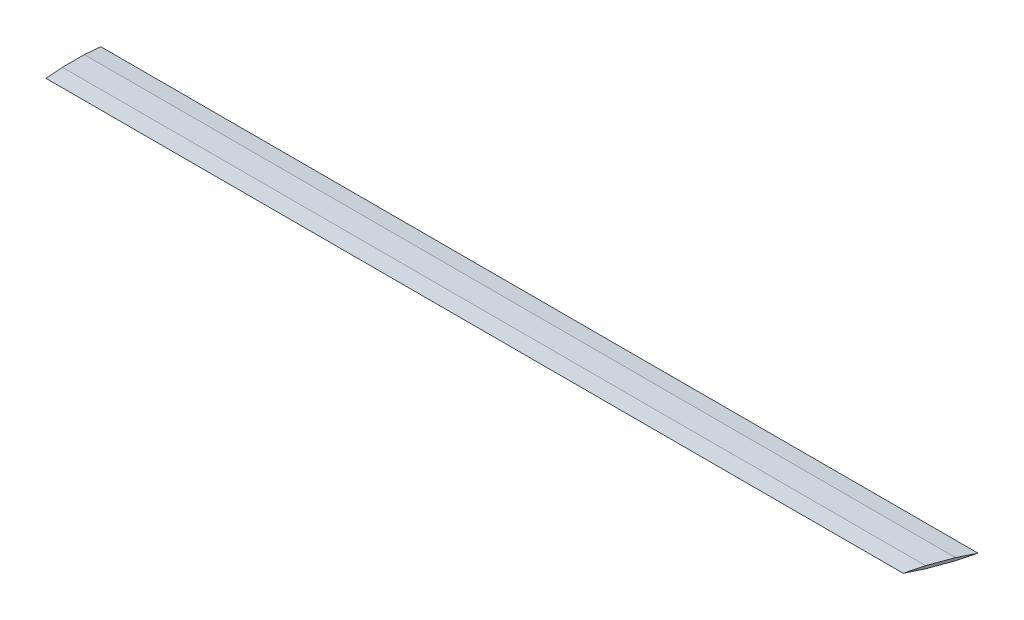
ISO-10303-21;
HEADER;
FILE_DESCRIPTION(('STEP AP214'),'2;1');
FILE_NAME('part.step','',(''),(''),'','','');
FILE_SCHEMA(('AUTOMOTIVE_DESIGN { 1 0 10303 214 1 1 1 1 }'));
ENDSEC;
DATA;
#1=APPLICATION_CONTEXT('core data for automotive mechanical design processes');
#2=APPLICATION_PROTOCOL_DEFINITION('international standard','automotive_design',2000,#1);
#3=PRODUCT_CONTEXT('',#1,'mechanical');
#4=PRODUCT('Part','Part','',(#3));
#5=PRODUCT_RELATED_PRODUCT_CATEGORY('part','',(#4));
#6=PRODUCT_DEFINITION_FORMATION('','',#4);
#7=PRODUCT_DEFINITION_CONTEXT('part definition',#1,'design');
#8=PRODUCT_DEFINITION('design','',#6,#7);
#9=PRODUCT_DEFINITION_SHAPE('','',#8);
#10=(LENGTH_UNIT() NAMED_UNIT(*) SI_UNIT(.MILLI.,.METRE.));
#11=(NAMED_UNIT(*) PLANE_ANGLE_UNIT() SI_UNIT($,.RADIAN.));
#12=(NAMED_UNIT(*) SI_UNIT($,.STERADIAN.) SOLID_ANGLE_UNIT());
#13=UNCERTAINTY_MEASURE_WITH_UNIT(LENGTH_MEASURE(1.E-05),#10,'distance_accuracy_value','');
#14=(GEOMETRIC_REPRESENTATION_CONTEXT(3) GLOBAL_UNCERTAINTY_ASSIGNED_CONTEXT((#13)) GLOBAL_UNIT_ASSIGNED_CONTEXT((#10,
#11,#12)) REPRESENTATION_CONTEXT('',''));
#15=CARTESIAN_POINT('',(0.,0.,0.));
#16=DIRECTION('',(0.,0.,1.));
#17=DIRECTION('',(1.,0.,0.));
#18=AXIS2_PLACEMENT_3D('',#15,#16,#17);
#19=CARTESIAN_POINT('',(0.,1.,0.));
#20=DIRECTION('',(-1.,0.,0.));
#21=DIRECTION('',(0.,0.,1.));
#22=AXIS2_PLACEMENT_3D('',#19,#20,#21);
#23=PLANE('',#22);
#24=DIRECTION('',(0.,0.,-1.));
#25=VECTOR('',#24,1.);
#26=CARTESIAN_POINT('',(0.,0.,0.));
#27=LINE('',#26,#25);
#28=CARTESIAN_POINT('',(0.,0.,14.));
#29=VERTEX_POINT('',#28);
#30=CARTESIAN_POINT('',(0.,0.,6.));
#31=VERTEX_POINT('',#30);
#32=EDGE_CURVE('E90',#29,#31,#27,.T.);
#33=ORIENTED_EDGE('',*,*,#32,.F.);
#34=DIRECTION('',(0.,0.08304547985374,0.99654575824488));
#35=VECTOR('',#34,1.);
#36=CARTESIAN_POINT('',(0.,-1.15172413793103,0.179310344827586));
#37=LINE('',#36,#35);
#38=CARTESIAN_POINT('',(0.,0.500000000000003,20.));
#39=VERTEX_POINT('',#38);
#40=EDGE_CURVE('E130',#29,#39,#37,.T.);
#41=ORIENTED_EDGE('',*,*,#40,.T.);
#42=DIRECTION('',(0.,-0.0830454798537364,0.99654575824488));
#43=VECTOR('',#42,1.);
#44=CARTESIAN_POINT('',(0.,2.1586206896551,0.0965517241379211));
#45=LINE('',#44,#43);
#46=CARTESIAN_POINT('',(0.,1.,13.9999999999998));
#47=VERTEX_POINT('',#46);
#48=EDGE_CURVE('E128',#39,#47,#45,.F.);
#49=ORIENTED_EDGE('',*,*,#48,.T.);
#50=DIRECTION('',(0.,0.,-1.));
#51=VECTOR('',#50,1.);
#52=CARTESIAN_POINT('',(0.,1.,0.));
#53=LINE('',#52,#51);
#54=CARTESIAN_POINT('',(0.,1.,6.00000000000028));
#55=VERTEX_POINT('',#54);
#56=EDGE_CURVE('E118',#47,#55,#53,.T.);
#57=ORIENTED_EDGE('',*,*,#56,.T.);
#58=DIRECTION('',(0.,0.0830454798537367,0.99654575824488));
#59=VECTOR('',#58,1.);
#60=CARTESIAN_POINT('',(0.,0.503448275862065,0.0413793103448263));
#61=LINE('',#60,#59);
#62=CARTESIAN_POINT('',(0.,0.499999999999996,0.));
#63=VERTEX_POINT('',#62);
#64=EDGE_CURVE('E106',#55,#63,#61,.F.);
#65=ORIENTED_EDGE('',*,*,#64,.T.);
#66=DIRECTION('',(0.,-0.08304547985374,0.99654575824488));
#67=VECTOR('',#66,1.);
#68=CARTESIAN_POINT('',(0.,0.503448275862069,-0.0413793103448276));
#69=LINE('',#68,#67);
#70=EDGE_CURVE('E104',#63,#31,#69,.T.);
#71=ORIENTED_EDGE('',*,*,#70,.T.);
#72=EDGE_LOOP('',(#33,#41,#49,#57,#65,#71));
#73=FACE_BOUND('',#72,.T.);
#74=ADVANCED_FACE('F35',(#73),#23,.T.);
#75=CARTESIAN_POINT('',(282.567110899036,1.,102.846017549847));
#76=DIRECTION('',(0.939692620785907,0.,0.342020143325672));
#77=DIRECTION('',(0.342020143325672,0.,-0.939692620785907));
#78=AXIS2_PLACEMENT_3D('',#75,#76,#77);
#79=PLANE('',#78);
#80=DIRECTION('',(0.340976290985637,0.0780687216710314,-0.936824660052418));
#81=VECTOR('',#80,1.);
#82=CARTESIAN_POINT('',(282.764197895067,-6.35871045654838,102.304525478584));
#83=LINE('',#82,#81);
#84=CARTESIAN_POINT('',(314.904416720273,1.,13.9999999999998));
#85=VERTEX_POINT('',#84);
#86=CARTESIAN_POINT('',(312.720595314676,0.500000000000003,20.));
#87=VERTEX_POINT('',#86);
#88=EDGE_CURVE('E51',#85,#87,#83,.F.);
#89=ORIENTED_EDGE('',*,*,#88,.T.);
#90=DIRECTION('',(0.340976290985637,-0.0780687216710348,-0.936824660052418));
#91=VECTOR('',#90,1.);
#92=CARTESIAN_POINT('',(282.737578311909,7.36480518185203,102.377662182224));
#93=LINE('',#92,#91);
#94=CARTESIAN_POINT('',(314.904416720273,0.,14.));
#95=VERTEX_POINT('',#94);
#96=EDGE_CURVE('E44',#87,#95,#93,.T.);
#97=ORIENTED_EDGE('',*,*,#96,.T.);
#98=DIRECTION('',(-0.342020143325672,0.,0.939692620785907));
#99=VECTOR('',#98,1.);
#100=CARTESIAN_POINT('',(282.567110899036,0.,102.846017549847));
#101=LINE('',#100,#99);
#102=CARTESIAN_POINT('',(317.816178594403,0.,5.99999999999999));
#103=VERTEX_POINT('',#102);
#104=EDGE_CURVE('E100',#103,#95,#101,.T.);
#105=ORIENTED_EDGE('',*,*,#104,.F.);
#106=DIRECTION('',(0.340976290985637,0.0780687216710348,-0.936824660052418));
#107=VECTOR('',#106,1.);
#108=CARTESIAN_POINT('',(282.808563866996,-8.01521924770977,102.182630972517));
#109=LINE('',#108,#107);
#110=CARTESIAN_POINT('',(320.,0.499999999999996,0.));
#111=VERTEX_POINT('',#110);
#112=EDGE_CURVE('E113',#103,#111,#109,.T.);
#113=ORIENTED_EDGE('',*,*,#112,.T.);
#114=DIRECTION('',(0.340976290985637,-0.0780687216710318,-0.936824660052418));
#115=VECTOR('',#114,1.);
#116=CARTESIAN_POINT('',(282.781944283838,9.02131397301278,102.255767676157));
#117=LINE('',#116,#115);
#118=CARTESIAN_POINT('',(317.816178594403,1.,6.00000000000027));
#119=VERTEX_POINT('',#118);
#120=EDGE_CURVE('E114',#111,#119,#117,.F.);
#121=ORIENTED_EDGE('',*,*,#120,.T.);
#122=DIRECTION('',(-0.342020143325672,0.,0.939692620785907));
#123=VECTOR('',#122,1.);
#124=CARTESIAN_POINT('',(282.567110899036,1.,102.846017549847));
#125=LINE('',#124,#123);
#126=EDGE_CURVE('E115',#119,#85,#125,.T.);
#127=ORIENTED_EDGE('',*,*,#126,.T.);
#128=EDGE_LOOP('',(#89,#97,#105,#113,#121,#127));
#129=FACE_BOUND('',#128,.T.);
#130=ADVANCED_FACE('F134',(#129),#79,.T.);
#131=CARTESIAN_POINT('',(0.,1.,0.));
#132=DIRECTION('',(0.,1.,0.));
#133=DIRECTION('',(0.,0.,1.));
#134=AXIS2_PLACEMENT_3D('',#131,#132,#133);
#135=PLANE('',#134);
#136=ORIENTED_EDGE('',*,*,#56,.F.);
#137=DIRECTION('',(1.,0.,0.));
#138=VECTOR('',#137,1.);
#139=CARTESIAN_POINT('',(0.,1.,13.9999999999998));
#140=LINE('',#139,#138);
#141=EDGE_CURVE('E11',#47,#85,#140,.T.);
#142=ORIENTED_EDGE('',*,*,#141,.T.);
#143=ORIENTED_EDGE('',*,*,#126,.F.);
#144=DIRECTION('',(-1.,0.,0.));
#145=VECTOR('',#144,1.);
#146=CARTESIAN_POINT('',(0.,1.,6.00000000000028));
#147=LINE('',#146,#145);
#148=EDGE_CURVE('E110',#119,#55,#147,.T.);
#149=ORIENTED_EDGE('',*,*,#148,.T.);
#150=EDGE_LOOP('',(#136,#142,#143,#149));
#151=FACE_BOUND('',#150,.T.);
#152=ADVANCED_FACE('F152',(#151),#135,.T.);
#153=CARTESIAN_POINT('',(0.,0.,0.));
#154=DIRECTION('',(0.,1.,0.));
#155=DIRECTION('',(0.,0.,1.));
#156=AXIS2_PLACEMENT_3D('',#153,#154,#155);
#157=PLANE('',#156);
#158=ORIENTED_EDGE('',*,*,#104,.T.);
#159=DIRECTION('',(-1.,0.,0.));
#160=VECTOR('',#159,1.);
#161=CARTESIAN_POINT('',(0.,0.,14.));
#162=LINE('',#161,#160);
#163=EDGE_CURVE('E98',#95,#29,#162,.T.);
#164=ORIENTED_EDGE('',*,*,#163,.T.);
#165=ORIENTED_EDGE('',*,*,#32,.T.);
#166=DIRECTION('',(1.,0.,0.));
#167=VECTOR('',#166,1.);
#168=CARTESIAN_POINT('',(320.,0.,6.));
#169=LINE('',#168,#167);
#170=EDGE_CURVE('E95',#31,#103,#169,.T.);
#171=ORIENTED_EDGE('',*,*,#170,.T.);
#172=EDGE_LOOP('',(#158,#164,#165,#171));
#173=FACE_BOUND('',#172,.T.);
#174=ADVANCED_FACE('F93',(#173),#157,.F.);
#175=CARTESIAN_POINT('',(0.,0.499999999999996,0.));
#176=DIRECTION('',(0.,-0.99654575824488,0.0830454798537367));
#177=DIRECTION('',(1.,0.,0.));
#178=AXIS2_PLACEMENT_3D('',#175,#176,#177);
#179=PLANE('',#178);
#180=DIRECTION('',(1.,0.,0.));
#181=VECTOR('',#180,1.);
#182=CARTESIAN_POINT('',(0.,0.499999999999996,0.));
#183=LINE('',#182,#181);
#184=EDGE_CURVE('E101',#63,#111,#183,.T.);
#185=ORIENTED_EDGE('',*,*,#184,.F.);
#186=ORIENTED_EDGE('',*,*,#64,.F.);
#187=ORIENTED_EDGE('',*,*,#148,.F.);
#188=ORIENTED_EDGE('',*,*,#120,.F.);
#189=EDGE_LOOP('',(#185,#186,#187,#188));
#190=FACE_BOUND('',#189,.T.);
#191=ADVANCED_FACE('F145',(#190),#179,.F.);
#192=CARTESIAN_POINT('',(0.,0.,6.));
#193=DIRECTION('',(0.,-0.99654575824488,-0.08304547985374));
#194=DIRECTION('',(-1.,0.,0.));
#195=AXIS2_PLACEMENT_3D('',#192,#193,#194);
#196=PLANE('',#195);
#197=ORIENTED_EDGE('',*,*,#70,.F.);
#198=ORIENTED_EDGE('',*,*,#184,.T.);
#199=ORIENTED_EDGE('',*,*,#112,.F.);
#200=ORIENTED_EDGE('',*,*,#170,.F.);
#201=EDGE_LOOP('',(#197,#198,#199,#200));
#202=FACE_BOUND('',#201,.T.);
#203=ADVANCED_FACE('F112',(#202),#196,.T.);
#204=CARTESIAN_POINT('',(0.,0.500000000000003,20.));
#205=DIRECTION('',(0.,-0.99654575824488,-0.0830454798537363));
#206=DIRECTION('',(-1.,0.,0.));
#207=AXIS2_PLACEMENT_3D('',#204,#205,#206);
#208=PLANE('',#207);
#209=DIRECTION('',(-1.,0.,0.));
#210=VECTOR('',#209,1.);
#211=CARTESIAN_POINT('',(0.,0.500000000000003,20.));
#212=LINE('',#211,#210);
#213=EDGE_CURVE('E39',#87,#39,#212,.T.);
#214=ORIENTED_EDGE('',*,*,#213,.F.);
#215=ORIENTED_EDGE('',*,*,#88,.F.);
#216=ORIENTED_EDGE('',*,*,#141,.F.);
#217=ORIENTED_EDGE('',*,*,#48,.F.);
#218=EDGE_LOOP('',(#214,#215,#216,#217));
#219=FACE_BOUND('',#218,.T.);
#220=ADVANCED_FACE('F37',(#219),#208,.F.);
#221=CARTESIAN_POINT('',(0.,0.,14.));
#222=DIRECTION('',(0.,-0.99654575824488,0.08304547985374));
#223=DIRECTION('',(1.,0.,0.));
#224=AXIS2_PLACEMENT_3D('',#221,#222,#223);
#225=PLANE('',#224);
#226=ORIENTED_EDGE('',*,*,#96,.F.);
#227=ORIENTED_EDGE('',*,*,#213,.T.);
#228=ORIENTED_EDGE('',*,*,#40,.F.);
#229=ORIENTED_EDGE('',*,*,#163,.F.);
#230=EDGE_LOOP('',(#226,#227,#228,#229));
#231=FACE_BOUND('',#230,.T.);
#232=ADVANCED_FACE('F137',(#231),#225,.T.);
#233=CLOSED_SHELL('',(#74,#130,#152,#174,#191,#203,#220,#232));
#234=MANIFOLD_SOLID_BREP('B2',#233);
#235=ADVANCED_BREP_SHAPE_REPRESENTATION('',(#18,#234),#14);
#236=SHAPE_DEFINITION_REPRESENTATION(#9,#235);
ENDSEC;
END-ISO-10303-21;
